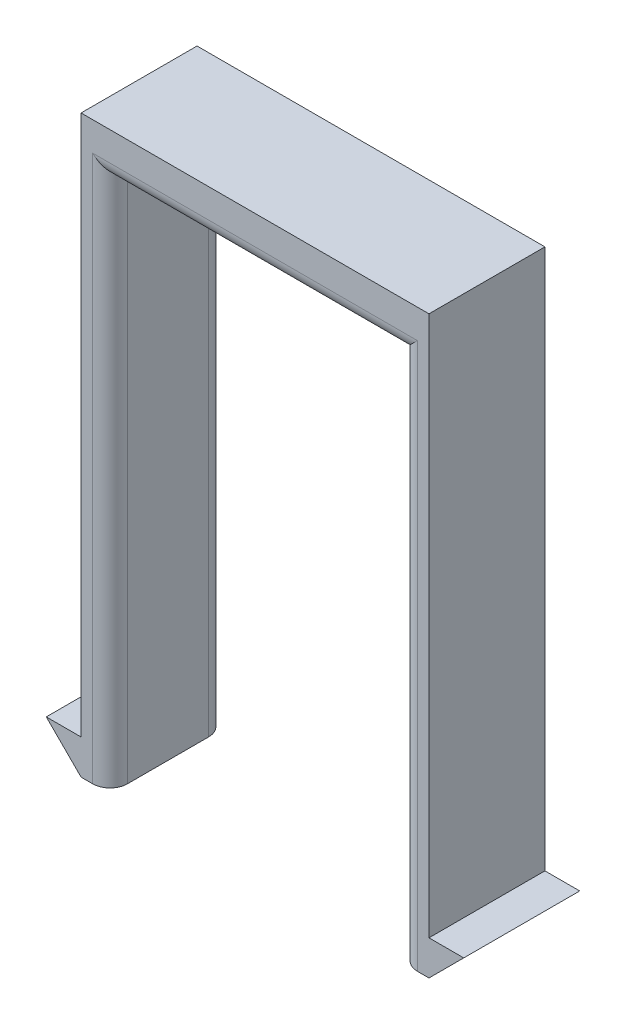
ISO-10303-21;
HEADER;
FILE_DESCRIPTION(('STEP AP214'),'2;1');
FILE_NAME('part.step','',(''),(''),'','','');
FILE_SCHEMA(('AUTOMOTIVE_DESIGN { 1 0 10303 214 1 1 1 1 }'));
ENDSEC;
DATA;
#1=APPLICATION_CONTEXT('core data for automotive mechanical design processes');
#2=APPLICATION_PROTOCOL_DEFINITION('international standard','automotive_design',2000,#1);
#3=PRODUCT_CONTEXT('',#1,'mechanical');
#4=PRODUCT('Part','Part','',(#3));
#5=PRODUCT_RELATED_PRODUCT_CATEGORY('part','',(#4));
#6=PRODUCT_DEFINITION_FORMATION('','',#4);
#7=PRODUCT_DEFINITION_CONTEXT('part definition',#1,'design');
#8=PRODUCT_DEFINITION('design','',#6,#7);
#9=PRODUCT_DEFINITION_SHAPE('','',#8);
#10=(LENGTH_UNIT() NAMED_UNIT(*) SI_UNIT(.MILLI.,.METRE.));
#11=(NAMED_UNIT(*) PLANE_ANGLE_UNIT() SI_UNIT($,.RADIAN.));
#12=(NAMED_UNIT(*) SI_UNIT($,.STERADIAN.) SOLID_ANGLE_UNIT());
#13=UNCERTAINTY_MEASURE_WITH_UNIT(LENGTH_MEASURE(1.E-05),#10,'distance_accuracy_value','');
#14=(GEOMETRIC_REPRESENTATION_CONTEXT(3) GLOBAL_UNCERTAINTY_ASSIGNED_CONTEXT((#13)) GLOBAL_UNIT_ASSIGNED_CONTEXT((#10,
#11,#12)) REPRESENTATION_CONTEXT('',''));
#15=CARTESIAN_POINT('',(0.,0.,0.));
#16=DIRECTION('',(0.,0.,1.));
#17=DIRECTION('',(1.,0.,0.));
#18=AXIS2_PLACEMENT_3D('',#15,#16,#17);
#19=CARTESIAN_POINT('',(15.,-2.,10.));
#20=DIRECTION('',(-1.,0.,0.));
#21=DIRECTION('',(0.,-1.,0.));
#22=AXIS2_PLACEMENT_3D('',#19,#20,#21);
#23=PLANE('',#22);
#24=DIRECTION('',(0.,0.,1.));
#25=VECTOR('',#24,1.);
#26=CARTESIAN_POINT('',(15.,-44.6,0.));
#27=LINE('',#26,#25);
#28=CARTESIAN_POINT('',(15.,-44.6,0.));
#29=VERTEX_POINT('',#28);
#30=CARTESIAN_POINT('',(15.,-44.6,10.));
#31=VERTEX_POINT('',#30);
#32=EDGE_CURVE('E278',#29,#31,#27,.T.);
#33=ORIENTED_EDGE('',*,*,#32,.F.);
#34=DIRECTION('',(0.,1.,0.));
#35=VECTOR('',#34,1.);
#36=CARTESIAN_POINT('',(15.,-2.,0.));
#37=LINE('',#36,#35);
#38=CARTESIAN_POINT('',(15.,2.,0.));
#39=VERTEX_POINT('',#38);
#40=EDGE_CURVE('E191',#29,#39,#37,.T.);
#41=ORIENTED_EDGE('',*,*,#40,.T.);
#42=DIRECTION('',(0.,0.,-1.));
#43=VECTOR('',#42,1.);
#44=CARTESIAN_POINT('',(15.,2.,10.));
#45=LINE('',#44,#43);
#46=CARTESIAN_POINT('',(15.,2.,10.));
#47=VERTEX_POINT('',#46);
#48=EDGE_CURVE('E227',#47,#39,#45,.T.);
#49=ORIENTED_EDGE('',*,*,#48,.F.);
#50=DIRECTION('',(0.,1.,0.));
#51=VECTOR('',#50,1.);
#52=CARTESIAN_POINT('',(15.,-2.,10.));
#53=LINE('',#52,#51);
#54=EDGE_CURVE('E201',#31,#47,#53,.T.);
#55=ORIENTED_EDGE('',*,*,#54,.F.);
#56=EDGE_LOOP('',(#33,#41,#49,#55));
#57=FACE_BOUND('',#56,.T.);
#58=ADVANCED_FACE('F44',(#57),#23,.F.);
#59=CARTESIAN_POINT('',(-15.,2.,10.));
#60=DIRECTION('',(0.,-1.,0.));
#61=DIRECTION('',(0.,0.,-1.));
#62=AXIS2_PLACEMENT_3D('',#59,#60,#61);
#63=PLANE('',#62);
#64=DIRECTION('',(-1.,0.,0.));
#65=VECTOR('',#64,1.);
#66=CARTESIAN_POINT('',(-15.,2.,0.));
#67=LINE('',#66,#65);
#68=CARTESIAN_POINT('',(-15.,2.,0.));
#69=VERTEX_POINT('',#68);
#70=EDGE_CURVE('E197',#39,#69,#67,.T.);
#71=ORIENTED_EDGE('',*,*,#70,.T.);
#72=DIRECTION('',(0.,0.,-1.));
#73=VECTOR('',#72,1.);
#74=CARTESIAN_POINT('',(-15.,2.,10.));
#75=LINE('',#74,#73);
#76=CARTESIAN_POINT('',(-15.,2.,10.));
#77=VERTEX_POINT('',#76);
#78=EDGE_CURVE('E185',#77,#69,#75,.T.);
#79=ORIENTED_EDGE('',*,*,#78,.F.);
#80=DIRECTION('',(-1.,0.,0.));
#81=VECTOR('',#80,1.);
#82=CARTESIAN_POINT('',(-15.,2.,10.));
#83=LINE('',#82,#81);
#84=EDGE_CURVE('E353',#47,#77,#83,.T.);
#85=ORIENTED_EDGE('',*,*,#84,.F.);
#86=ORIENTED_EDGE('',*,*,#48,.T.);
#87=EDGE_LOOP('',(#71,#79,#85,#86));
#88=FACE_BOUND('',#87,.T.);
#89=ADVANCED_FACE('F389',(#88),#63,.F.);
#90=CARTESIAN_POINT('',(-15.,-2.,10.));
#91=DIRECTION('',(1.,0.,0.));
#92=DIRECTION('',(0.,1.,0.));
#93=AXIS2_PLACEMENT_3D('',#90,#91,#92);
#94=PLANE('',#93);
#95=DIRECTION('',(0.,-1.,0.));
#96=VECTOR('',#95,1.);
#97=CARTESIAN_POINT('',(-15.,-2.,0.));
#98=LINE('',#97,#96);
#99=CARTESIAN_POINT('',(-15.,-44.6,0.));
#100=VERTEX_POINT('',#99);
#101=EDGE_CURVE('E190',#69,#100,#98,.T.);
#102=ORIENTED_EDGE('',*,*,#101,.T.);
#103=DIRECTION('',(0.,0.,1.));
#104=VECTOR('',#103,1.);
#105=CARTESIAN_POINT('',(-15.,-44.6,0.));
#106=LINE('',#105,#104);
#107=CARTESIAN_POINT('',(-15.,-44.6,10.));
#108=VERTEX_POINT('',#107);
#109=EDGE_CURVE('E367',#100,#108,#106,.T.);
#110=ORIENTED_EDGE('',*,*,#109,.T.);
#111=DIRECTION('',(0.,-1.,0.));
#112=VECTOR('',#111,1.);
#113=CARTESIAN_POINT('',(-15.,-2.,10.));
#114=LINE('',#113,#112);
#115=EDGE_CURVE('E359',#77,#108,#114,.T.);
#116=ORIENTED_EDGE('',*,*,#115,.F.);
#117=ORIENTED_EDGE('',*,*,#78,.T.);
#118=EDGE_LOOP('',(#102,#110,#116,#117));
#119=FACE_BOUND('',#118,.T.);
#120=ADVANCED_FACE('F391',(#119),#94,.F.);
#121=CARTESIAN_POINT('',(-15.,-47.6,10.));
#122=DIRECTION('',(0.,1.,0.));
#123=DIRECTION('',(0.,0.,1.));
#124=AXIS2_PLACEMENT_3D('',#121,#122,#123);
#125=PLANE('',#124);
#126=DIRECTION('',(1.,0.,0.));
#127=VECTOR('',#126,1.);
#128=CARTESIAN_POINT('',(-15.,-47.6,0.));
#129=LINE('',#128,#127);
#130=CARTESIAN_POINT('',(-15.,-47.6,0.));
#131=VERTEX_POINT('',#130);
#132=CARTESIAN_POINT('',(-14.,-47.6,0.));
#133=VERTEX_POINT('',#132);
#134=EDGE_CURVE('E180',#131,#133,#129,.T.);
#135=ORIENTED_EDGE('',*,*,#134,.T.);
#136=CARTESIAN_POINT('',(-14.,-47.6,1.5));
#137=DIRECTION('',(0.,1.,0.));
#138=DIRECTION('',(0.,0.,1.));
#139=AXIS2_PLACEMENT_3D('',#136,#137,#138);
#140=CIRCLE('',#139,1.5);
#141=CARTESIAN_POINT('',(-12.5,-47.6,1.5));
#142=VERTEX_POINT('',#141);
#143=EDGE_CURVE('E246',#133,#142,#140,.F.);
#144=ORIENTED_EDGE('',*,*,#143,.T.);
#145=DIRECTION('',(0.,0.,-1.));
#146=VECTOR('',#145,1.);
#147=CARTESIAN_POINT('',(-12.5,-47.6,10.));
#148=LINE('',#147,#146);
#149=CARTESIAN_POINT('',(-12.5,-47.6,8.5));
#150=VERTEX_POINT('',#149);
#151=EDGE_CURVE('E181',#150,#142,#148,.T.);
#152=ORIENTED_EDGE('',*,*,#151,.F.);
#153=CARTESIAN_POINT('',(-14.,-47.6,8.5));
#154=DIRECTION('',(0.,1.,0.));
#155=DIRECTION('',(0.,0.,1.));
#156=AXIS2_PLACEMENT_3D('',#153,#154,#155);
#157=CIRCLE('',#156,1.5);
#158=CARTESIAN_POINT('',(-14.,-47.6,10.));
#159=VERTEX_POINT('',#158);
#160=EDGE_CURVE('E247',#150,#159,#157,.F.);
#161=ORIENTED_EDGE('',*,*,#160,.T.);
#162=DIRECTION('',(1.,0.,0.));
#163=VECTOR('',#162,1.);
#164=CARTESIAN_POINT('',(-15.,-47.6,10.));
#165=LINE('',#164,#163);
#166=CARTESIAN_POINT('',(-15.,-47.6,10.));
#167=VERTEX_POINT('',#166);
#168=EDGE_CURVE('E178',#167,#159,#165,.T.);
#169=ORIENTED_EDGE('',*,*,#168,.F.);
#170=DIRECTION('',(0.,0.,-1.));
#171=VECTOR('',#170,1.);
#172=CARTESIAN_POINT('',(-15.,-47.6,10.));
#173=LINE('',#172,#171);
#174=EDGE_CURVE('E162',#167,#131,#173,.T.);
#175=ORIENTED_EDGE('',*,*,#174,.T.);
#176=EDGE_LOOP('',(#135,#144,#152,#161,#169,#175));
#177=FACE_BOUND('',#176,.T.);
#178=ADVANCED_FACE('F179',(#177),#125,.F.);
#179=CARTESIAN_POINT('',(-12.5,-2.,10.));
#180=DIRECTION('',(-1.,0.,0.));
#181=DIRECTION('',(0.,-1.,0.));
#182=AXIS2_PLACEMENT_3D('',#179,#180,#181);
#183=PLANE('',#182);
#184=ORIENTED_EDGE('',*,*,#151,.T.);
#185=DIRECTION('',(0.,1.,0.));
#186=VECTOR('',#185,1.);
#187=CARTESIAN_POINT('',(-12.5,-2.,1.5));
#188=LINE('',#187,#186);
#189=CARTESIAN_POINT('',(-12.5,-2.,1.5));
#190=VERTEX_POINT('',#189);
#191=EDGE_CURVE('E231',#142,#190,#188,.T.);
#192=ORIENTED_EDGE('',*,*,#191,.T.);
#193=DIRECTION('',(0.,0.,-1.));
#194=VECTOR('',#193,1.);
#195=CARTESIAN_POINT('',(-12.5,-2.,10.));
#196=LINE('',#195,#194);
#197=CARTESIAN_POINT('',(-12.5,-2.,8.5));
#198=VERTEX_POINT('',#197);
#199=EDGE_CURVE('E220',#198,#190,#196,.T.);
#200=ORIENTED_EDGE('',*,*,#199,.F.);
#201=DIRECTION('',(0.,1.,0.));
#202=VECTOR('',#201,1.);
#203=CARTESIAN_POINT('',(-12.5,-2.,8.5));
#204=LINE('',#203,#202);
#205=EDGE_CURVE('E232',#198,#150,#204,.F.);
#206=ORIENTED_EDGE('',*,*,#205,.T.);
#207=EDGE_LOOP('',(#184,#192,#200,#206));
#208=FACE_BOUND('',#207,.T.);
#209=ADVANCED_FACE('F299',(#208),#183,.F.);
#210=CARTESIAN_POINT('',(-12.5,-2.,10.));
#211=DIRECTION('',(0.,1.,0.));
#212=DIRECTION('',(-1.,0.,0.));
#213=AXIS2_PLACEMENT_3D('',#210,#211,#212);
#214=PLANE('',#213);
#215=ORIENTED_EDGE('',*,*,#199,.T.);
#216=DIRECTION('',(1.,0.,0.));
#217=VECTOR('',#216,1.);
#218=CARTESIAN_POINT('',(12.5,-2.,1.5));
#219=LINE('',#218,#217);
#220=CARTESIAN_POINT('',(12.5,-2.,1.5));
#221=VERTEX_POINT('',#220);
#222=EDGE_CURVE('E254',#190,#221,#219,.T.);
#223=ORIENTED_EDGE('',*,*,#222,.T.);
#224=DIRECTION('',(0.,0.,-1.));
#225=VECTOR('',#224,1.);
#226=CARTESIAN_POINT('',(12.5,-2.,10.));
#227=LINE('',#226,#225);
#228=CARTESIAN_POINT('',(12.5,-2.,8.5));
#229=VERTEX_POINT('',#228);
#230=EDGE_CURVE('E213',#229,#221,#227,.T.);
#231=ORIENTED_EDGE('',*,*,#230,.F.);
#232=DIRECTION('',(1.,0.,0.));
#233=VECTOR('',#232,1.);
#234=CARTESIAN_POINT('',(-12.5,-2.,8.5));
#235=LINE('',#234,#233);
#236=EDGE_CURVE('E252',#229,#198,#235,.F.);
#237=ORIENTED_EDGE('',*,*,#236,.T.);
#238=EDGE_LOOP('',(#215,#223,#231,#237));
#239=FACE_BOUND('',#238,.T.);
#240=ADVANCED_FACE('F303',(#239),#214,.F.);
#241=CARTESIAN_POINT('',(12.5,-2.,10.));
#242=DIRECTION('',(1.,0.,0.));
#243=DIRECTION('',(0.,1.,0.));
#244=AXIS2_PLACEMENT_3D('',#241,#242,#243);
#245=PLANE('',#244);
#246=ORIENTED_EDGE('',*,*,#230,.T.);
#247=DIRECTION('',(0.,-1.,0.));
#248=VECTOR('',#247,1.);
#249=CARTESIAN_POINT('',(12.5,-47.6,1.5));
#250=LINE('',#249,#248);
#251=CARTESIAN_POINT('',(12.5,-47.6,1.5));
#252=VERTEX_POINT('',#251);
#253=EDGE_CURVE('E261',#221,#252,#250,.T.);
#254=ORIENTED_EDGE('',*,*,#253,.T.);
#255=DIRECTION('',(0.,0.,-1.));
#256=VECTOR('',#255,1.);
#257=CARTESIAN_POINT('',(12.5,-47.6,10.));
#258=LINE('',#257,#256);
#259=CARTESIAN_POINT('',(12.5,-47.6,8.5));
#260=VERTEX_POINT('',#259);
#261=EDGE_CURVE('E208',#260,#252,#258,.T.);
#262=ORIENTED_EDGE('',*,*,#261,.F.);
#263=DIRECTION('',(0.,-1.,0.));
#264=VECTOR('',#263,1.);
#265=CARTESIAN_POINT('',(12.5,-2.,8.5));
#266=LINE('',#265,#264);
#267=EDGE_CURVE('E256',#260,#229,#266,.F.);
#268=ORIENTED_EDGE('',*,*,#267,.T.);
#269=EDGE_LOOP('',(#246,#254,#262,#268));
#270=FACE_BOUND('',#269,.T.);
#271=ADVANCED_FACE('F310',(#270),#245,.F.);
#272=CARTESIAN_POINT('',(15.,-47.6,10.));
#273=DIRECTION('',(0.,1.,0.));
#274=DIRECTION('',(0.,0.,1.));
#275=AXIS2_PLACEMENT_3D('',#272,#273,#274);
#276=PLANE('',#275);
#277=ORIENTED_EDGE('',*,*,#261,.T.);
#278=CARTESIAN_POINT('',(14.,-47.6,1.5));
#279=DIRECTION('',(0.,1.,0.));
#280=DIRECTION('',(0.,0.,1.));
#281=AXIS2_PLACEMENT_3D('',#278,#279,#280);
#282=CIRCLE('',#281,1.5);
#283=CARTESIAN_POINT('',(14.,-47.6,0.));
#284=VERTEX_POINT('',#283);
#285=EDGE_CURVE('E270',#252,#284,#282,.F.);
#286=ORIENTED_EDGE('',*,*,#285,.T.);
#287=DIRECTION('',(1.,0.,0.));
#288=VECTOR('',#287,1.);
#289=CARTESIAN_POINT('',(15.,-47.6,0.));
#290=LINE('',#289,#288);
#291=CARTESIAN_POINT('',(15.,-47.6,0.));
#292=VERTEX_POINT('',#291);
#293=EDGE_CURVE('E188',#284,#292,#290,.T.);
#294=ORIENTED_EDGE('',*,*,#293,.T.);
#295=DIRECTION('',(0.,0.,-1.));
#296=VECTOR('',#295,1.);
#297=CARTESIAN_POINT('',(15.,-47.6,10.));
#298=LINE('',#297,#296);
#299=CARTESIAN_POINT('',(15.,-47.6,10.));
#300=VERTEX_POINT('',#299);
#301=EDGE_CURVE('E204',#300,#292,#298,.T.);
#302=ORIENTED_EDGE('',*,*,#301,.F.);
#303=DIRECTION('',(1.,0.,0.));
#304=VECTOR('',#303,1.);
#305=CARTESIAN_POINT('',(15.,-47.6,10.));
#306=LINE('',#305,#304);
#307=CARTESIAN_POINT('',(14.,-47.6,10.));
#308=VERTEX_POINT('',#307);
#309=EDGE_CURVE('E207',#308,#300,#306,.T.);
#310=ORIENTED_EDGE('',*,*,#309,.F.);
#311=CARTESIAN_POINT('',(14.,-47.6,8.5));
#312=DIRECTION('',(0.,1.,0.));
#313=DIRECTION('',(0.,0.,1.));
#314=AXIS2_PLACEMENT_3D('',#311,#312,#313);
#315=CIRCLE('',#314,1.5);
#316=EDGE_CURVE('E262',#308,#260,#315,.F.);
#317=ORIENTED_EDGE('',*,*,#316,.T.);
#318=EDGE_LOOP('',(#277,#286,#294,#302,#310,#317));
#319=FACE_BOUND('',#318,.T.);
#320=ADVANCED_FACE('F326',(#319),#276,.F.);
#321=CARTESIAN_POINT('',(0.,0.,10.));
#322=DIRECTION('',(0.,0.,-1.));
#323=DIRECTION('',(-1.,0.,0.));
#324=AXIS2_PLACEMENT_3D('',#321,#322,#323);
#325=PLANE('',#324);
#326=DIRECTION('',(1.,0.,0.));
#327=VECTOR('',#326,1.);
#328=CARTESIAN_POINT('',(0.,-0.500000000000002,10.));
#329=LINE('',#328,#327);
#330=CARTESIAN_POINT('',(-14.,-0.500000000000003,10.));
#331=VERTEX_POINT('',#330);
#332=CARTESIAN_POINT('',(14.,-0.5,10.));
#333=VERTEX_POINT('',#332);
#334=EDGE_CURVE('E54',#331,#333,#329,.T.);
#335=ORIENTED_EDGE('',*,*,#334,.T.);
#336=DIRECTION('',(0.,-1.,0.));
#337=VECTOR('',#336,1.);
#338=CARTESIAN_POINT('',(14.,0.,10.));
#339=LINE('',#338,#337);
#340=EDGE_CURVE('E11',#333,#308,#339,.T.);
#341=ORIENTED_EDGE('',*,*,#340,.T.);
#342=ORIENTED_EDGE('',*,*,#309,.T.);
#343=DIRECTION('',(0.707106781186547,0.707106781186548,0.));
#344=VECTOR('',#343,1.);
#345=CARTESIAN_POINT('',(18.,-44.6,10.));
#346=LINE('',#345,#344);
#347=CARTESIAN_POINT('',(18.,-44.6,10.));
#348=VERTEX_POINT('',#347);
#349=EDGE_CURVE('E335',#300,#348,#346,.T.);
#350=ORIENTED_EDGE('',*,*,#349,.T.);
#351=DIRECTION('',(-1.,0.,0.));
#352=VECTOR('',#351,1.);
#353=CARTESIAN_POINT('',(15.,-44.6,10.));
#354=LINE('',#353,#352);
#355=EDGE_CURVE('E339',#348,#31,#354,.T.);
#356=ORIENTED_EDGE('',*,*,#355,.T.);
#357=ORIENTED_EDGE('',*,*,#54,.T.);
#358=ORIENTED_EDGE('',*,*,#84,.T.);
#359=ORIENTED_EDGE('',*,*,#115,.T.);
#360=DIRECTION('',(-1.,0.,0.));
#361=VECTOR('',#360,1.);
#362=CARTESIAN_POINT('',(-15.,-44.6,10.));
#363=LINE('',#362,#361);
#364=CARTESIAN_POINT('',(-18.,-44.6,10.));
#365=VERTEX_POINT('',#364);
#366=EDGE_CURVE('E172',#108,#365,#363,.T.);
#367=ORIENTED_EDGE('',*,*,#366,.T.);
#368=DIRECTION('',(0.707106781186547,-0.707106781186548,0.));
#369=VECTOR('',#368,1.);
#370=CARTESIAN_POINT('',(-18.,-44.6,10.));
#371=LINE('',#370,#369);
#372=EDGE_CURVE('E337',#365,#167,#371,.T.);
#373=ORIENTED_EDGE('',*,*,#372,.T.);
#374=ORIENTED_EDGE('',*,*,#168,.T.);
#375=DIRECTION('',(0.,1.,0.));
#376=VECTOR('',#375,1.);
#377=CARTESIAN_POINT('',(-14.,0.,10.));
#378=LINE('',#377,#376);
#379=EDGE_CURVE('E67',#159,#331,#378,.T.);
#380=ORIENTED_EDGE('',*,*,#379,.T.);
#381=EDGE_LOOP('',(#335,#341,#342,#350,#356,#357,#358,#359,#367,#373,#374,#380));
#382=FACE_BOUND('',#381,.T.);
#383=ADVANCED_FACE('F384',(#382),#325,.F.);
#384=CARTESIAN_POINT('',(0.,0.,0.));
#385=DIRECTION('',(0.,0.,-1.));
#386=DIRECTION('',(-1.,0.,0.));
#387=AXIS2_PLACEMENT_3D('',#384,#385,#386);
#388=PLANE('',#387);
#389=DIRECTION('',(1.,0.,0.));
#390=VECTOR('',#389,1.);
#391=CARTESIAN_POINT('',(-12.5,-0.500000000000003,0.));
#392=LINE('',#391,#390);
#393=CARTESIAN_POINT('',(14.,-0.5,0.));
#394=VERTEX_POINT('',#393);
#395=CARTESIAN_POINT('',(-14.,-0.500000000000003,0.));
#396=VERTEX_POINT('',#395);
#397=EDGE_CURVE('E241',#394,#396,#392,.F.);
#398=ORIENTED_EDGE('',*,*,#397,.T.);
#399=DIRECTION('',(0.,1.,0.));
#400=VECTOR('',#399,1.);
#401=CARTESIAN_POINT('',(-14.,-47.6,0.));
#402=LINE('',#401,#400);
#403=EDGE_CURVE('E187',#396,#133,#402,.F.);
#404=ORIENTED_EDGE('',*,*,#403,.T.);
#405=ORIENTED_EDGE('',*,*,#134,.F.);
#406=DIRECTION('',(0.707106781186547,-0.707106781186548,0.));
#407=VECTOR('',#406,1.);
#408=CARTESIAN_POINT('',(-18.,-44.6,0.));
#409=LINE('',#408,#407);
#410=CARTESIAN_POINT('',(-18.,-44.6,0.));
#411=VERTEX_POINT('',#410);
#412=EDGE_CURVE('E157',#411,#131,#409,.T.);
#413=ORIENTED_EDGE('',*,*,#412,.F.);
#414=DIRECTION('',(-1.,0.,0.));
#415=VECTOR('',#414,1.);
#416=CARTESIAN_POINT('',(-15.,-44.6,0.));
#417=LINE('',#416,#415);
#418=EDGE_CURVE('E171',#100,#411,#417,.T.);
#419=ORIENTED_EDGE('',*,*,#418,.F.);
#420=ORIENTED_EDGE('',*,*,#101,.F.);
#421=ORIENTED_EDGE('',*,*,#70,.F.);
#422=ORIENTED_EDGE('',*,*,#40,.F.);
#423=DIRECTION('',(-1.,0.,0.));
#424=VECTOR('',#423,1.);
#425=CARTESIAN_POINT('',(15.,-44.6,0.));
#426=LINE('',#425,#424);
#427=CARTESIAN_POINT('',(18.,-44.6,0.));
#428=VERTEX_POINT('',#427);
#429=EDGE_CURVE('E347',#428,#29,#426,.T.);
#430=ORIENTED_EDGE('',*,*,#429,.F.);
#431=DIRECTION('',(0.707106781186547,0.707106781186548,0.));
#432=VECTOR('',#431,1.);
#433=CARTESIAN_POINT('',(18.,-44.6,0.));
#434=LINE('',#433,#432);
#435=EDGE_CURVE('E323',#292,#428,#434,.T.);
#436=ORIENTED_EDGE('',*,*,#435,.F.);
#437=ORIENTED_EDGE('',*,*,#293,.F.);
#438=DIRECTION('',(0.,-1.,0.));
#439=VECTOR('',#438,1.);
#440=CARTESIAN_POINT('',(14.,-2.,0.));
#441=LINE('',#440,#439);
#442=EDGE_CURVE('E236',#284,#394,#441,.F.);
#443=ORIENTED_EDGE('',*,*,#442,.T.);
#444=EDGE_LOOP('',(#398,#404,#405,#413,#419,#420,#421,#422,#430,#436,#437,#443));
#445=FACE_BOUND('',#444,.T.);
#446=ADVANCED_FACE('F183',(#445),#388,.T.);
#447=CARTESIAN_POINT('',(15.,-44.6,0.));
#448=DIRECTION('',(0.,1.,0.));
#449=DIRECTION('',(0.,0.,1.));
#450=AXIS2_PLACEMENT_3D('',#447,#448,#449);
#451=PLANE('',#450);
#452=ORIENTED_EDGE('',*,*,#355,.F.);
#453=DIRECTION('',(0.,0.,1.));
#454=VECTOR('',#453,1.);
#455=CARTESIAN_POINT('',(18.,-44.6,0.));
#456=LINE('',#455,#454);
#457=EDGE_CURVE('E334',#428,#348,#456,.T.);
#458=ORIENTED_EDGE('',*,*,#457,.F.);
#459=ORIENTED_EDGE('',*,*,#429,.T.);
#460=ORIENTED_EDGE('',*,*,#32,.T.);
#461=EDGE_LOOP('',(#452,#458,#459,#460));
#462=FACE_BOUND('',#461,.T.);
#463=ADVANCED_FACE('F385',(#462),#451,.T.);
#464=CARTESIAN_POINT('',(18.,-44.6,0.));
#465=DIRECTION('',(0.707106781186548,-0.707106781186547,0.));
#466=DIRECTION('',(0.707106781186547,0.707106781186548,0.));
#467=AXIS2_PLACEMENT_3D('',#464,#465,#466);
#468=PLANE('',#467);
#469=ORIENTED_EDGE('',*,*,#349,.F.);
#470=ORIENTED_EDGE('',*,*,#301,.T.);
#471=ORIENTED_EDGE('',*,*,#435,.T.);
#472=ORIENTED_EDGE('',*,*,#457,.T.);
#473=EDGE_LOOP('',(#469,#470,#471,#472));
#474=FACE_BOUND('',#473,.T.);
#475=ADVANCED_FACE('F329',(#474),#468,.T.);
#476=CARTESIAN_POINT('',(-18.,-44.6,0.));
#477=DIRECTION('',(-0.707106781186548,-0.707106781186547,0.));
#478=DIRECTION('',(0.707106781186547,-0.707106781186548,0.));
#479=AXIS2_PLACEMENT_3D('',#476,#477,#478);
#480=PLANE('',#479);
#481=ORIENTED_EDGE('',*,*,#372,.F.);
#482=DIRECTION('',(0.,0.,1.));
#483=VECTOR('',#482,1.);
#484=CARTESIAN_POINT('',(-18.,-44.6,0.));
#485=LINE('',#484,#483);
#486=EDGE_CURVE('E164',#411,#365,#485,.T.);
#487=ORIENTED_EDGE('',*,*,#486,.F.);
#488=ORIENTED_EDGE('',*,*,#412,.T.);
#489=ORIENTED_EDGE('',*,*,#174,.F.);
#490=EDGE_LOOP('',(#481,#487,#488,#489));
#491=FACE_BOUND('',#490,.T.);
#492=ADVANCED_FACE('F165',(#491),#480,.T.);
#493=CARTESIAN_POINT('',(-15.,-44.6,0.));
#494=DIRECTION('',(0.,1.,0.));
#495=DIRECTION('',(0.,0.,1.));
#496=AXIS2_PLACEMENT_3D('',#493,#494,#495);
#497=PLANE('',#496);
#498=ORIENTED_EDGE('',*,*,#366,.F.);
#499=ORIENTED_EDGE('',*,*,#109,.F.);
#500=ORIENTED_EDGE('',*,*,#418,.T.);
#501=ORIENTED_EDGE('',*,*,#486,.T.);
#502=EDGE_LOOP('',(#498,#499,#500,#501));
#503=FACE_BOUND('',#502,.T.);
#504=ADVANCED_FACE('F397',(#503),#497,.T.);
#505=CARTESIAN_POINT('',(14.,-2.,1.5));
#506=DIRECTION('',(0.,1.,0.));
#507=DIRECTION('',(-1.,0.,0.));
#508=AXIS2_PLACEMENT_3D('',#505,#506,#507);
#509=CYLINDRICAL_SURFACE('',#508,1.5);
#510=ORIENTED_EDGE('',*,*,#285,.F.);
#511=ORIENTED_EDGE('',*,*,#253,.F.);
#512=CARTESIAN_POINT('',(14.,-0.5,1.5));
#513=DIRECTION('',(-0.707106781186548,0.707106781186547,0.));
#514=DIRECTION('',(-0.707106781186547,-0.707106781186548,0.));
#515=AXIS2_PLACEMENT_3D('',#512,#513,#514);
#516=ELLIPSE('',#515,2.12132034355964,1.5);
#517=EDGE_CURVE('E280',#394,#221,#516,.T.);
#518=ORIENTED_EDGE('',*,*,#517,.F.);
#519=ORIENTED_EDGE('',*,*,#442,.F.);
#520=EDGE_LOOP('',(#510,#511,#518,#519));
#521=FACE_BOUND('',#520,.T.);
#522=ADVANCED_FACE('F314',(#521),#509,.T.);
#523=CARTESIAN_POINT('',(-12.5,-0.500000000000003,1.5));
#524=DIRECTION('',(-1.,0.,0.));
#525=DIRECTION('',(0.,-1.,0.));
#526=AXIS2_PLACEMENT_3D('',#523,#524,#525);
#527=CYLINDRICAL_SURFACE('',#526,1.5);
#528=ORIENTED_EDGE('',*,*,#517,.T.);
#529=ORIENTED_EDGE('',*,*,#222,.F.);
#530=CARTESIAN_POINT('',(-14.,-0.500000000000003,1.5));
#531=DIRECTION('',(-0.707106781186547,-0.707106781186548,0.));
#532=DIRECTION('',(0.707106781186548,-0.707106781186547,0.));
#533=AXIS2_PLACEMENT_3D('',#530,#531,#532);
#534=ELLIPSE('',#533,2.12132034355964,1.5);
#535=EDGE_CURVE('E273',#396,#190,#534,.T.);
#536=ORIENTED_EDGE('',*,*,#535,.F.);
#537=ORIENTED_EDGE('',*,*,#397,.F.);
#538=EDGE_LOOP('',(#528,#529,#536,#537));
#539=FACE_BOUND('',#538,.T.);
#540=ADVANCED_FACE('F318',(#539),#527,.T.);
#541=CARTESIAN_POINT('',(-14.,-2.,1.5));
#542=DIRECTION('',(0.,-1.,0.));
#543=DIRECTION('',(1.,0.,0.));
#544=AXIS2_PLACEMENT_3D('',#541,#542,#543);
#545=CYLINDRICAL_SURFACE('',#544,1.5);
#546=ORIENTED_EDGE('',*,*,#143,.F.);
#547=ORIENTED_EDGE('',*,*,#403,.F.);
#548=ORIENTED_EDGE('',*,*,#535,.T.);
#549=ORIENTED_EDGE('',*,*,#191,.F.);
#550=EDGE_LOOP('',(#546,#547,#548,#549));
#551=FACE_BOUND('',#550,.T.);
#552=ADVANCED_FACE('F302',(#551),#545,.T.);
#553=CARTESIAN_POINT('',(-14.,0.,8.5));
#554=DIRECTION('',(0.,1.,0.));
#555=DIRECTION('',(-1.,0.,0.));
#556=AXIS2_PLACEMENT_3D('',#553,#554,#555);
#557=CYLINDRICAL_SURFACE('',#556,1.5);
#558=ORIENTED_EDGE('',*,*,#160,.F.);
#559=ORIENTED_EDGE('',*,*,#205,.F.);
#560=CARTESIAN_POINT('',(-14.,-0.500000000000003,8.5));
#561=DIRECTION('',(0.707106781186547,0.707106781186548,0.));
#562=DIRECTION('',(0.707106781186548,-0.707106781186547,0.));
#563=AXIS2_PLACEMENT_3D('',#560,#561,#562);
#564=ELLIPSE('',#563,2.12132034355964,1.5);
#565=EDGE_CURVE('E47',#331,#198,#564,.T.);
#566=ORIENTED_EDGE('',*,*,#565,.F.);
#567=ORIENTED_EDGE('',*,*,#379,.F.);
#568=EDGE_LOOP('',(#558,#559,#566,#567));
#569=FACE_BOUND('',#568,.T.);
#570=ADVANCED_FACE('F50',(#569),#557,.T.);
#571=CARTESIAN_POINT('',(0.,-0.500000000000002,8.5));
#572=DIRECTION('',(1.,0.,0.));
#573=DIRECTION('',(0.,1.,0.));
#574=AXIS2_PLACEMENT_3D('',#571,#572,#573);
#575=CYLINDRICAL_SURFACE('',#574,1.5);
#576=ORIENTED_EDGE('',*,*,#565,.T.);
#577=ORIENTED_EDGE('',*,*,#236,.F.);
#578=CARTESIAN_POINT('',(14.,-0.5,8.5));
#579=DIRECTION('',(0.707106781186548,-0.707106781186547,0.));
#580=DIRECTION('',(-0.707106781186547,-0.707106781186548,0.));
#581=AXIS2_PLACEMENT_3D('',#578,#579,#580);
#582=ELLIPSE('',#581,2.12132034355964,1.5);
#583=EDGE_CURVE('E281',#333,#229,#582,.T.);
#584=ORIENTED_EDGE('',*,*,#583,.F.);
#585=ORIENTED_EDGE('',*,*,#334,.F.);
#586=EDGE_LOOP('',(#576,#577,#584,#585));
#587=FACE_BOUND('',#586,.T.);
#588=ADVANCED_FACE('F292',(#587),#575,.T.);
#589=CARTESIAN_POINT('',(14.,0.,8.5));
#590=DIRECTION('',(0.,-1.,0.));
#591=DIRECTION('',(1.,0.,0.));
#592=AXIS2_PLACEMENT_3D('',#589,#590,#591);
#593=CYLINDRICAL_SURFACE('',#592,1.5);
#594=ORIENTED_EDGE('',*,*,#583,.T.);
#595=ORIENTED_EDGE('',*,*,#267,.F.);
#596=ORIENTED_EDGE('',*,*,#316,.F.);
#597=ORIENTED_EDGE('',*,*,#340,.F.);
#598=EDGE_LOOP('',(#594,#595,#596,#597));
#599=FACE_BOUND('',#598,.T.);
#600=ADVANCED_FACE('F429',(#599),#593,.T.);
#601=CLOSED_SHELL('',(#58,#89,#120,#178,#209,#240,#271,#320,#383,#446,#463,#475,#492,#504,#522,
#540,#552,#570,#588,#600));
#602=MANIFOLD_SOLID_BREP('B2',#601);
#603=ADVANCED_BREP_SHAPE_REPRESENTATION('',(#18,#602),#14);
#604=SHAPE_DEFINITION_REPRESENTATION(#9,#603);
ENDSEC;
END-ISO-10303-21;
